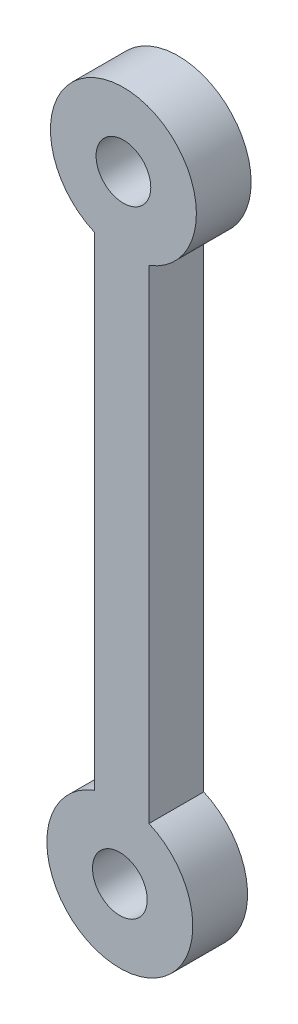
ISO-10303-21;
HEADER;
FILE_DESCRIPTION(('STEP AP214'),'2;1');
FILE_NAME('part.step','',(''),(''),'','','');
FILE_SCHEMA(('AUTOMOTIVE_DESIGN { 1 0 10303 214 1 1 1 1 }'));
ENDSEC;
DATA;
#1=APPLICATION_CONTEXT('core data for automotive mechanical design processes');
#2=APPLICATION_PROTOCOL_DEFINITION('international standard','automotive_design',2000,#1);
#3=PRODUCT_CONTEXT('',#1,'mechanical');
#4=PRODUCT('Part','Part','',(#3));
#5=PRODUCT_RELATED_PRODUCT_CATEGORY('part','',(#4));
#6=PRODUCT_DEFINITION_FORMATION('','',#4);
#7=PRODUCT_DEFINITION_CONTEXT('part definition',#1,'design');
#8=PRODUCT_DEFINITION('design','',#6,#7);
#9=PRODUCT_DEFINITION_SHAPE('','',#8);
#10=(LENGTH_UNIT() NAMED_UNIT(*) SI_UNIT(.MILLI.,.METRE.));
#11=(NAMED_UNIT(*) PLANE_ANGLE_UNIT() SI_UNIT($,.RADIAN.));
#12=(NAMED_UNIT(*) SI_UNIT($,.STERADIAN.) SOLID_ANGLE_UNIT());
#13=UNCERTAINTY_MEASURE_WITH_UNIT(LENGTH_MEASURE(1.E-05),#10,'distance_accuracy_value','');
#14=(GEOMETRIC_REPRESENTATION_CONTEXT(3) GLOBAL_UNCERTAINTY_ASSIGNED_CONTEXT((#13)) GLOBAL_UNIT_ASSIGNED_CONTEXT((#10,
#11,#12)) REPRESENTATION_CONTEXT('',''));
#15=CARTESIAN_POINT('',(0.,0.,0.));
#16=DIRECTION('',(0.,0.,1.));
#17=DIRECTION('',(1.,0.,0.));
#18=AXIS2_PLACEMENT_3D('',#15,#16,#17);
#19=CARTESIAN_POINT('',(1.40221813718847,-3.7461692828461,3.));
#20=DIRECTION('',(0.,0.,1.));
#21=DIRECTION('',(1.,0.,0.));
#22=AXIS2_PLACEMENT_3D('',#19,#20,#21);
#23=PLANE('',#22);
#24=CARTESIAN_POINT('',(1.59778186281153,30.1670278317557,3.));
#25=DIRECTION('',(0.,0.,1.));
#26=DIRECTION('',(1.,0.,0.));
#27=AXIS2_PLACEMENT_3D('',#24,#25,#26);
#28=CIRCLE('',#27,1.5);
#29=CARTESIAN_POINT('',(3.09778186281153,30.1670278317557,3.));
#30=VERTEX_POINT('',#29);
#31=EDGE_CURVE('E101',#30,#30,#28,.T.);
#32=ORIENTED_EDGE('',*,*,#31,.F.);
#33=EDGE_LOOP('',(#32));
#34=FACE_BOUND('',#33,.T.);
#35=CARTESIAN_POINT('',(1.40221813718847,-3.7461692828461,3.));
#36=DIRECTION('',(0.,0.,1.));
#37=DIRECTION('',(1.,0.,0.));
#38=AXIS2_PLACEMENT_3D('',#35,#36,#37);
#39=CIRCLE('',#38,4.);
#40=CARTESIAN_POINT('',(0.,0.,3.));
#41=VERTEX_POINT('',#40);
#42=CARTESIAN_POINT('',(3.,-0.0791414510904557,3.));
#43=VERTEX_POINT('',#42);
#44=EDGE_CURVE('E86',#41,#43,#39,.T.);
#45=ORIENTED_EDGE('',*,*,#44,.T.);
#46=DIRECTION('',(0.,1.,0.));
#47=VECTOR('',#46,1.);
#48=CARTESIAN_POINT('',(3.,26.4208585489095,3.));
#49=LINE('',#48,#47);
#50=CARTESIAN_POINT('',(3.,26.4208585489095,3.));
#51=VERTEX_POINT('',#50);
#52=EDGE_CURVE('E81',#43,#51,#49,.T.);
#53=ORIENTED_EDGE('',*,*,#52,.T.);
#54=CARTESIAN_POINT('',(1.59778186281153,30.1670278317557,3.));
#55=DIRECTION('',(0.,0.,1.));
#56=DIRECTION('',(-1.,0.,0.));
#57=AXIS2_PLACEMENT_3D('',#54,#55,#56);
#58=CIRCLE('',#57,4.);
#59=CARTESIAN_POINT('',(0.,26.5,3.));
#60=VERTEX_POINT('',#59);
#61=EDGE_CURVE('E84',#51,#60,#58,.T.);
#62=ORIENTED_EDGE('',*,*,#61,.T.);
#63=DIRECTION('',(0.,-1.,0.));
#64=VECTOR('',#63,1.);
#65=CARTESIAN_POINT('',(0.,0.,3.));
#66=LINE('',#65,#64);
#67=EDGE_CURVE('E51',#60,#41,#66,.T.);
#68=ORIENTED_EDGE('',*,*,#67,.T.);
#69=EDGE_LOOP('',(#45,#53,#62,#68));
#70=FACE_BOUND('',#69,.T.);
#71=CARTESIAN_POINT('',(1.40221813718847,-3.7461692828461,3.));
#72=DIRECTION('',(0.,0.,1.));
#73=DIRECTION('',(1.,0.,0.));
#74=AXIS2_PLACEMENT_3D('',#71,#72,#73);
#75=CIRCLE('',#74,1.5);
#76=CARTESIAN_POINT('',(2.90221813718847,-3.7461692828461,3.));
#77=VERTEX_POINT('',#76);
#78=EDGE_CURVE('E116',#77,#77,#75,.T.);
#79=ORIENTED_EDGE('',*,*,#78,.F.);
#80=EDGE_LOOP('',(#79));
#81=FACE_BOUND('',#80,.T.);
#82=ADVANCED_FACE('F34',(#34,#70,#81),#23,.T.);
#83=CARTESIAN_POINT('',(1.40221813718847,-3.7461692828461,0.));
#84=DIRECTION('',(0.,0.,1.));
#85=DIRECTION('',(1.,0.,0.));
#86=AXIS2_PLACEMENT_3D('',#83,#84,#85);
#87=PLANE('',#86);
#88=CARTESIAN_POINT('',(1.40221813718847,-3.7461692828461,0.));
#89=DIRECTION('',(0.,0.,1.));
#90=DIRECTION('',(1.,0.,0.));
#91=AXIS2_PLACEMENT_3D('',#88,#89,#90);
#92=CIRCLE('',#91,4.);
#93=CARTESIAN_POINT('',(0.,0.,0.));
#94=VERTEX_POINT('',#93);
#95=CARTESIAN_POINT('',(3.,-0.0791414510904557,0.));
#96=VERTEX_POINT('',#95);
#97=EDGE_CURVE('E98',#94,#96,#92,.T.);
#98=ORIENTED_EDGE('',*,*,#97,.F.);
#99=DIRECTION('',(0.,-1.,0.));
#100=VECTOR('',#99,1.);
#101=CARTESIAN_POINT('',(0.,0.,0.));
#102=LINE('',#101,#100);
#103=CARTESIAN_POINT('',(0.,26.5,0.));
#104=VERTEX_POINT('',#103);
#105=EDGE_CURVE('E74',#104,#94,#102,.T.);
#106=ORIENTED_EDGE('',*,*,#105,.F.);
#107=CARTESIAN_POINT('',(1.59778186281153,30.1670278317557,0.));
#108=DIRECTION('',(0.,0.,1.));
#109=DIRECTION('',(-1.,0.,0.));
#110=AXIS2_PLACEMENT_3D('',#107,#108,#109);
#111=CIRCLE('',#110,4.);
#112=CARTESIAN_POINT('',(3.,26.4208585489095,0.));
#113=VERTEX_POINT('',#112);
#114=EDGE_CURVE('E68',#113,#104,#111,.T.);
#115=ORIENTED_EDGE('',*,*,#114,.F.);
#116=DIRECTION('',(0.,1.,0.));
#117=VECTOR('',#116,1.);
#118=CARTESIAN_POINT('',(3.,26.4208585489095,0.));
#119=LINE('',#118,#117);
#120=EDGE_CURVE('E90',#96,#113,#119,.T.);
#121=ORIENTED_EDGE('',*,*,#120,.F.);
#122=EDGE_LOOP('',(#98,#106,#115,#121));
#123=FACE_BOUND('',#122,.T.);
#124=CARTESIAN_POINT('',(1.59778186281153,30.1670278317557,0.));
#125=DIRECTION('',(0.,0.,1.));
#126=DIRECTION('',(1.,0.,0.));
#127=AXIS2_PLACEMENT_3D('',#124,#125,#126);
#128=CIRCLE('',#127,1.5);
#129=CARTESIAN_POINT('',(3.09778186281153,30.1670278317557,0.));
#130=VERTEX_POINT('',#129);
#131=EDGE_CURVE('E113',#130,#130,#128,.T.);
#132=ORIENTED_EDGE('',*,*,#131,.T.);
#133=EDGE_LOOP('',(#132));
#134=FACE_BOUND('',#133,.T.);
#135=CARTESIAN_POINT('',(1.40221813718847,-3.7461692828461,0.));
#136=DIRECTION('',(0.,0.,1.));
#137=DIRECTION('',(1.,0.,0.));
#138=AXIS2_PLACEMENT_3D('',#135,#136,#137);
#139=CIRCLE('',#138,1.5);
#140=CARTESIAN_POINT('',(2.90221813718847,-3.7461692828461,0.));
#141=VERTEX_POINT('',#140);
#142=EDGE_CURVE('E119',#141,#141,#139,.T.);
#143=ORIENTED_EDGE('',*,*,#142,.T.);
#144=EDGE_LOOP('',(#143));
#145=FACE_BOUND('',#144,.T.);
#146=ADVANCED_FACE('F109',(#123,#134,#145),#87,.F.);
#147=CARTESIAN_POINT('',(1.40221813718847,-3.7461692828461,3.));
#148=DIRECTION('',(0.,0.,-1.));
#149=DIRECTION('',(-1.,0.,0.));
#150=AXIS2_PLACEMENT_3D('',#147,#148,#149);
#151=CYLINDRICAL_SURFACE('',#150,4.);
#152=ORIENTED_EDGE('',*,*,#97,.T.);
#153=DIRECTION('',(0.,0.,-1.));
#154=VECTOR('',#153,1.);
#155=CARTESIAN_POINT('',(3.,-0.0791414510904557,3.));
#156=LINE('',#155,#154);
#157=EDGE_CURVE('E11',#43,#96,#156,.T.);
#158=ORIENTED_EDGE('',*,*,#157,.F.);
#159=ORIENTED_EDGE('',*,*,#44,.F.);
#160=DIRECTION('',(0.,0.,-1.));
#161=VECTOR('',#160,1.);
#162=CARTESIAN_POINT('',(0.,0.,3.));
#163=LINE('',#162,#161);
#164=EDGE_CURVE('E94',#41,#94,#163,.T.);
#165=ORIENTED_EDGE('',*,*,#164,.T.);
#166=EDGE_LOOP('',(#152,#158,#159,#165));
#167=FACE_BOUND('',#166,.T.);
#168=ADVANCED_FACE('F36',(#167),#151,.T.);
#169=CARTESIAN_POINT('',(3.,26.4208585489095,3.));
#170=DIRECTION('',(-1.,0.,0.));
#171=DIRECTION('',(0.,-1.,0.));
#172=AXIS2_PLACEMENT_3D('',#169,#170,#171);
#173=PLANE('',#172);
#174=ORIENTED_EDGE('',*,*,#120,.T.);
#175=DIRECTION('',(0.,0.,-1.));
#176=VECTOR('',#175,1.);
#177=CARTESIAN_POINT('',(3.,26.4208585489095,3.));
#178=LINE('',#177,#176);
#179=EDGE_CURVE('E43',#51,#113,#178,.T.);
#180=ORIENTED_EDGE('',*,*,#179,.F.);
#181=ORIENTED_EDGE('',*,*,#52,.F.);
#182=ORIENTED_EDGE('',*,*,#157,.T.);
#183=EDGE_LOOP('',(#174,#180,#181,#182));
#184=FACE_BOUND('',#183,.T.);
#185=ADVANCED_FACE('F89',(#184),#173,.F.);
#186=CARTESIAN_POINT('',(1.59778186281153,30.1670278317557,3.));
#187=DIRECTION('',(0.,0.,-1.));
#188=DIRECTION('',(-1.,0.,0.));
#189=AXIS2_PLACEMENT_3D('',#186,#187,#188);
#190=CYLINDRICAL_SURFACE('',#189,4.);
#191=ORIENTED_EDGE('',*,*,#114,.T.);
#192=DIRECTION('',(0.,0.,-1.));
#193=VECTOR('',#192,1.);
#194=CARTESIAN_POINT('',(0.,26.5,3.));
#195=LINE('',#194,#193);
#196=EDGE_CURVE('E91',#60,#104,#195,.T.);
#197=ORIENTED_EDGE('',*,*,#196,.F.);
#198=ORIENTED_EDGE('',*,*,#61,.F.);
#199=ORIENTED_EDGE('',*,*,#179,.T.);
#200=EDGE_LOOP('',(#191,#197,#198,#199));
#201=FACE_BOUND('',#200,.T.);
#202=ADVANCED_FACE('F92',(#201),#190,.T.);
#203=CARTESIAN_POINT('',(0.,0.,3.));
#204=DIRECTION('',(1.,0.,0.));
#205=DIRECTION('',(0.,0.,-1.));
#206=AXIS2_PLACEMENT_3D('',#203,#204,#205);
#207=PLANE('',#206);
#208=ORIENTED_EDGE('',*,*,#105,.T.);
#209=ORIENTED_EDGE('',*,*,#164,.F.);
#210=ORIENTED_EDGE('',*,*,#67,.F.);
#211=ORIENTED_EDGE('',*,*,#196,.T.);
#212=EDGE_LOOP('',(#208,#209,#210,#211));
#213=FACE_BOUND('',#212,.T.);
#214=ADVANCED_FACE('F106',(#213),#207,.F.);
#215=CARTESIAN_POINT('',(1.59778186281153,30.1670278317557,3.));
#216=DIRECTION('',(0.,0.,-1.));
#217=DIRECTION('',(-1.,0.,0.));
#218=AXIS2_PLACEMENT_3D('',#215,#216,#217);
#219=CYLINDRICAL_SURFACE('',#218,1.5);
#220=ORIENTED_EDGE('',*,*,#31,.T.);
#221=EDGE_LOOP('',(#220));
#222=FACE_BOUND('',#221,.T.);
#223=ORIENTED_EDGE('',*,*,#131,.F.);
#224=EDGE_LOOP('',(#223));
#225=FACE_BOUND('',#224,.T.);
#226=ADVANCED_FACE('F136',(#222,#225),#219,.F.);
#227=CARTESIAN_POINT('',(1.40221813718847,-3.7461692828461,3.));
#228=DIRECTION('',(0.,0.,-1.));
#229=DIRECTION('',(-1.,0.,0.));
#230=AXIS2_PLACEMENT_3D('',#227,#228,#229);
#231=CYLINDRICAL_SURFACE('',#230,1.5);
#232=ORIENTED_EDGE('',*,*,#78,.T.);
#233=EDGE_LOOP('',(#232));
#234=FACE_BOUND('',#233,.T.);
#235=ORIENTED_EDGE('',*,*,#142,.F.);
#236=EDGE_LOOP('',(#235));
#237=FACE_BOUND('',#236,.T.);
#238=ADVANCED_FACE('F125',(#234,#237),#231,.F.);
#239=CLOSED_SHELL('',(#82,#146,#168,#185,#202,#214,#226,#238));
#240=MANIFOLD_SOLID_BREP('B2',#239);
#241=ADVANCED_BREP_SHAPE_REPRESENTATION('',(#18,#240),#14);
#242=SHAPE_DEFINITION_REPRESENTATION(#9,#241);
ENDSEC;
END-ISO-10303-21;
